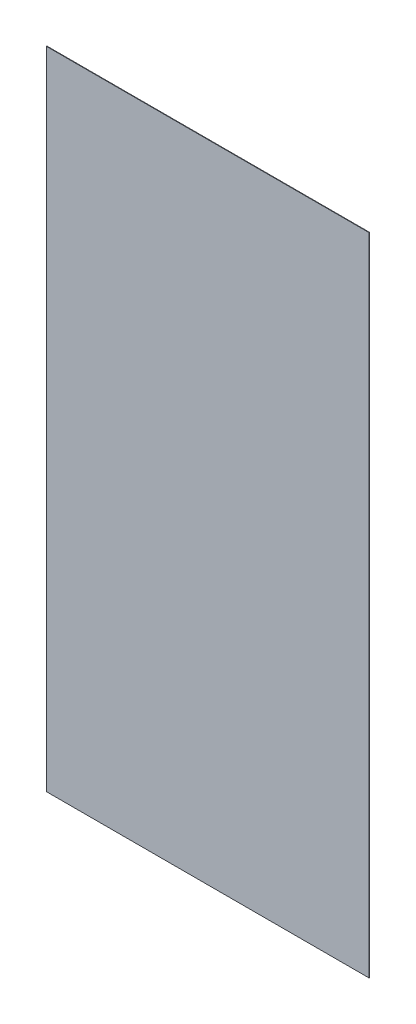
ISO-10303-21;
HEADER;
FILE_DESCRIPTION(('STEP AP214'),'2;1');
FILE_NAME('part.step','',(''),(''),'','','');
FILE_SCHEMA(('AUTOMOTIVE_DESIGN { 1 0 10303 214 1 1 1 1 }'));
ENDSEC;
DATA;
#1=APPLICATION_CONTEXT('core data for automotive mechanical design processes');
#2=APPLICATION_PROTOCOL_DEFINITION('international standard','automotive_design',2000,#1);
#3=PRODUCT_CONTEXT('',#1,'mechanical');
#4=PRODUCT('Part','Part','',(#3));
#5=PRODUCT_RELATED_PRODUCT_CATEGORY('part','',(#4));
#6=PRODUCT_DEFINITION_FORMATION('','',#4);
#7=PRODUCT_DEFINITION_CONTEXT('part definition',#1,'design');
#8=PRODUCT_DEFINITION('design','',#6,#7);
#9=PRODUCT_DEFINITION_SHAPE('','',#8);
#10=(LENGTH_UNIT() NAMED_UNIT(*) SI_UNIT(.MILLI.,.METRE.));
#11=(NAMED_UNIT(*) PLANE_ANGLE_UNIT() SI_UNIT($,.RADIAN.));
#12=(NAMED_UNIT(*) SI_UNIT($,.STERADIAN.) SOLID_ANGLE_UNIT());
#13=UNCERTAINTY_MEASURE_WITH_UNIT(LENGTH_MEASURE(1.E-05),#10,'distance_accuracy_value','');
#14=(GEOMETRIC_REPRESENTATION_CONTEXT(3) GLOBAL_UNCERTAINTY_ASSIGNED_CONTEXT((#13)) GLOBAL_UNIT_ASSIGNED_CONTEXT((#10,
#11,#12)) REPRESENTATION_CONTEXT('',''));
#15=CARTESIAN_POINT('',(0.,0.,0.));
#16=DIRECTION('',(0.,0.,1.));
#17=DIRECTION('',(1.,0.,0.));
#18=AXIS2_PLACEMENT_3D('',#15,#16,#17);
#19=CARTESIAN_POINT('',(0.,0.,1.9));
#20=DIRECTION('',(1.,0.,0.));
#21=DIRECTION('',(0.,0.,-1.));
#22=AXIS2_PLACEMENT_3D('',#19,#20,#21);
#23=PLANE('',#22);
#24=DIRECTION('',(0.,-1.,0.));
#25=VECTOR('',#24,1.);
#26=CARTESIAN_POINT('',(0.,0.,0.));
#27=LINE('',#26,#25);
#28=CARTESIAN_POINT('',(0.,0.,0.));
#29=VERTEX_POINT('',#28);
#30=CARTESIAN_POINT('',(0.,-2440.,0.));
#31=VERTEX_POINT('',#30);
#32=EDGE_CURVE('E99',#29,#31,#27,.T.);
#33=ORIENTED_EDGE('',*,*,#32,.T.);
#34=DIRECTION('',(0.,0.,-1.));
#35=VECTOR('',#34,1.);
#36=CARTESIAN_POINT('',(0.,-2440.,1.9));
#37=LINE('',#36,#35);
#38=CARTESIAN_POINT('',(0.,-2440.,1.9));
#39=VERTEX_POINT('',#38);
#40=EDGE_CURVE('E11',#39,#31,#37,.T.);
#41=ORIENTED_EDGE('',*,*,#40,.F.);
#42=DIRECTION('',(0.,-1.,0.));
#43=VECTOR('',#42,1.);
#44=CARTESIAN_POINT('',(0.,0.,1.9));
#45=LINE('',#44,#43);
#46=CARTESIAN_POINT('',(0.,0.,1.9));
#47=VERTEX_POINT('',#46);
#48=EDGE_CURVE('E87',#47,#39,#45,.T.);
#49=ORIENTED_EDGE('',*,*,#48,.F.);
#50=DIRECTION('',(0.,0.,-1.));
#51=VECTOR('',#50,1.);
#52=CARTESIAN_POINT('',(0.,0.,1.9));
#53=LINE('',#52,#51);
#54=EDGE_CURVE('E95',#47,#29,#53,.T.);
#55=ORIENTED_EDGE('',*,*,#54,.T.);
#56=EDGE_LOOP('',(#33,#41,#49,#55));
#57=FACE_BOUND('',#56,.T.);
#58=ADVANCED_FACE('F36',(#57),#23,.F.);
#59=CARTESIAN_POINT('',(0.,-2440.,1.9));
#60=DIRECTION('',(0.,1.,0.));
#61=DIRECTION('',(0.,0.,1.));
#62=AXIS2_PLACEMENT_3D('',#59,#60,#61);
#63=PLANE('',#62);
#64=DIRECTION('',(1.,0.,0.));
#65=VECTOR('',#64,1.);
#66=CARTESIAN_POINT('',(0.,-2440.,0.));
#67=LINE('',#66,#65);
#68=CARTESIAN_POINT('',(1220.,-2440.,0.));
#69=VERTEX_POINT('',#68);
#70=EDGE_CURVE('E91',#31,#69,#67,.T.);
#71=ORIENTED_EDGE('',*,*,#70,.T.);
#72=DIRECTION('',(0.,0.,-1.));
#73=VECTOR('',#72,1.);
#74=CARTESIAN_POINT('',(1220.,-2440.,1.9));
#75=LINE('',#74,#73);
#76=CARTESIAN_POINT('',(1220.,-2440.,1.9));
#77=VERTEX_POINT('',#76);
#78=EDGE_CURVE('E44',#77,#69,#75,.T.);
#79=ORIENTED_EDGE('',*,*,#78,.F.);
#80=DIRECTION('',(1.,0.,0.));
#81=VECTOR('',#80,1.);
#82=CARTESIAN_POINT('',(0.,-2440.,1.9));
#83=LINE('',#82,#81);
#84=EDGE_CURVE('E82',#39,#77,#83,.T.);
#85=ORIENTED_EDGE('',*,*,#84,.F.);
#86=ORIENTED_EDGE('',*,*,#40,.T.);
#87=EDGE_LOOP('',(#71,#79,#85,#86));
#88=FACE_BOUND('',#87,.T.);
#89=ADVANCED_FACE('F90',(#88),#63,.F.);
#90=CARTESIAN_POINT('',(1220.,0.,1.9));
#91=DIRECTION('',(-1.,0.,0.));
#92=DIRECTION('',(0.,-1.,0.));
#93=AXIS2_PLACEMENT_3D('',#90,#91,#92);
#94=PLANE('',#93);
#95=DIRECTION('',(0.,1.,0.));
#96=VECTOR('',#95,1.);
#97=CARTESIAN_POINT('',(1220.,0.,0.));
#98=LINE('',#97,#96);
#99=CARTESIAN_POINT('',(1220.,0.,0.));
#100=VERTEX_POINT('',#99);
#101=EDGE_CURVE('E69',#69,#100,#98,.T.);
#102=ORIENTED_EDGE('',*,*,#101,.T.);
#103=DIRECTION('',(0.,0.,-1.));
#104=VECTOR('',#103,1.);
#105=CARTESIAN_POINT('',(1220.,0.,1.9));
#106=LINE('',#105,#104);
#107=CARTESIAN_POINT('',(1220.,0.,1.9));
#108=VERTEX_POINT('',#107);
#109=EDGE_CURVE('E92',#108,#100,#106,.T.);
#110=ORIENTED_EDGE('',*,*,#109,.F.);
#111=DIRECTION('',(0.,1.,0.));
#112=VECTOR('',#111,1.);
#113=CARTESIAN_POINT('',(1220.,0.,1.9));
#114=LINE('',#113,#112);
#115=EDGE_CURVE('E85',#77,#108,#114,.T.);
#116=ORIENTED_EDGE('',*,*,#115,.F.);
#117=ORIENTED_EDGE('',*,*,#78,.T.);
#118=EDGE_LOOP('',(#102,#110,#116,#117));
#119=FACE_BOUND('',#118,.T.);
#120=ADVANCED_FACE('F93',(#119),#94,.F.);
#121=CARTESIAN_POINT('',(0.,0.,1.9));
#122=DIRECTION('',(0.,-1.,0.));
#123=DIRECTION('',(0.,0.,-1.));
#124=AXIS2_PLACEMENT_3D('',#121,#122,#123);
#125=PLANE('',#124);
#126=DIRECTION('',(-1.,0.,0.));
#127=VECTOR('',#126,1.);
#128=CARTESIAN_POINT('',(0.,0.,0.));
#129=LINE('',#128,#127);
#130=EDGE_CURVE('E75',#100,#29,#129,.T.);
#131=ORIENTED_EDGE('',*,*,#130,.T.);
#132=ORIENTED_EDGE('',*,*,#54,.F.);
#133=DIRECTION('',(-1.,0.,0.));
#134=VECTOR('',#133,1.);
#135=CARTESIAN_POINT('',(0.,0.,1.9));
#136=LINE('',#135,#134);
#137=EDGE_CURVE('E52',#108,#47,#136,.T.);
#138=ORIENTED_EDGE('',*,*,#137,.F.);
#139=ORIENTED_EDGE('',*,*,#109,.T.);
#140=EDGE_LOOP('',(#131,#132,#138,#139));
#141=FACE_BOUND('',#140,.T.);
#142=ADVANCED_FACE('F106',(#141),#125,.F.);
#143=CARTESIAN_POINT('',(0.,0.,1.9));
#144=DIRECTION('',(0.,0.,1.));
#145=DIRECTION('',(1.,0.,0.));
#146=AXIS2_PLACEMENT_3D('',#143,#144,#145);
#147=PLANE('',#146);
#148=ORIENTED_EDGE('',*,*,#48,.T.);
#149=ORIENTED_EDGE('',*,*,#84,.T.);
#150=ORIENTED_EDGE('',*,*,#115,.T.);
#151=ORIENTED_EDGE('',*,*,#137,.T.);
#152=EDGE_LOOP('',(#148,#149,#150,#151));
#153=FACE_BOUND('',#152,.T.);
#154=ADVANCED_FACE('F83',(#153),#147,.T.);
#155=CARTESIAN_POINT('',(0.,0.,0.));
#156=DIRECTION('',(0.,0.,1.));
#157=DIRECTION('',(1.,0.,0.));
#158=AXIS2_PLACEMENT_3D('',#155,#156,#157);
#159=PLANE('',#158);
#160=ORIENTED_EDGE('',*,*,#32,.F.);
#161=ORIENTED_EDGE('',*,*,#130,.F.);
#162=ORIENTED_EDGE('',*,*,#101,.F.);
#163=ORIENTED_EDGE('',*,*,#70,.F.);
#164=EDGE_LOOP('',(#160,#161,#162,#163));
#165=FACE_BOUND('',#164,.T.);
#166=ADVANCED_FACE('F109',(#165),#159,.F.);
#167=CLOSED_SHELL('',(#58,#89,#120,#142,#154,#166));
#168=MANIFOLD_SOLID_BREP('B2',#167);
#169=ADVANCED_BREP_SHAPE_REPRESENTATION('',(#18,#168),#14);
#170=SHAPE_DEFINITION_REPRESENTATION(#9,#169);
ENDSEC;
END-ISO-10303-21;
